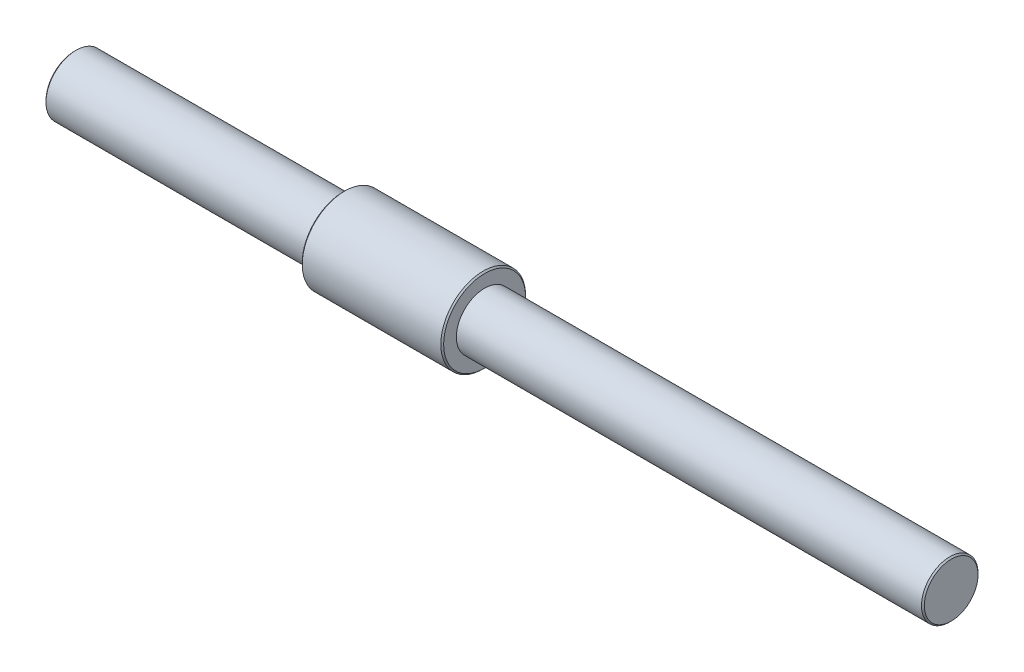
ISO-10303-21;
HEADER;
FILE_DESCRIPTION(('STEP AP214'),'2;1');
FILE_NAME('part.step','',(''),(''),'','','');
FILE_SCHEMA(('AUTOMOTIVE_DESIGN { 1 0 10303 214 1 1 1 1 }'));
ENDSEC;
DATA;
#1=APPLICATION_CONTEXT('core data for automotive mechanical design processes');
#2=APPLICATION_PROTOCOL_DEFINITION('international standard','automotive_design',2000,#1);
#3=PRODUCT_CONTEXT('',#1,'mechanical');
#4=PRODUCT('Part','Part','',(#3));
#5=PRODUCT_RELATED_PRODUCT_CATEGORY('part','',(#4));
#6=PRODUCT_DEFINITION_FORMATION('','',#4);
#7=PRODUCT_DEFINITION_CONTEXT('part definition',#1,'design');
#8=PRODUCT_DEFINITION('design','',#6,#7);
#9=PRODUCT_DEFINITION_SHAPE('','',#8);
#10=(LENGTH_UNIT() NAMED_UNIT(*) SI_UNIT(.MILLI.,.METRE.));
#11=(NAMED_UNIT(*) PLANE_ANGLE_UNIT() SI_UNIT($,.RADIAN.));
#12=(NAMED_UNIT(*) SI_UNIT($,.STERADIAN.) SOLID_ANGLE_UNIT());
#13=UNCERTAINTY_MEASURE_WITH_UNIT(LENGTH_MEASURE(1.E-05),#10,'distance_accuracy_value','');
#14=(GEOMETRIC_REPRESENTATION_CONTEXT(3) GLOBAL_UNCERTAINTY_ASSIGNED_CONTEXT((#13)) GLOBAL_UNIT_ASSIGNED_CONTEXT((#10,
#11,#12)) REPRESENTATION_CONTEXT('',''));
#15=CARTESIAN_POINT('',(0.,0.,0.));
#16=DIRECTION('',(0.,0.,1.));
#17=DIRECTION('',(1.,0.,0.));
#18=AXIS2_PLACEMENT_3D('',#15,#16,#17);
#19=CARTESIAN_POINT('',(0.,2.125,0.));
#20=DIRECTION('',(1.,0.,0.));
#21=DIRECTION('',(0.,0.,-1.));
#22=AXIS2_PLACEMENT_3D('',#19,#20,#21);
#23=PLANE('',#22);
#24=CARTESIAN_POINT('',(0.,0.,0.));
#25=DIRECTION('',(1.,0.,0.));
#26=DIRECTION('',(0.,0.,-1.));
#27=AXIS2_PLACEMENT_3D('',#24,#25,#26);
#28=CIRCLE('',#27,2.02500000000001);
#29=CARTESIAN_POINT('',(0.,0.,-2.02500000000001));
#30=VERTEX_POINT('',#29);
#31=EDGE_CURVE('E66',#30,#30,#28,.F.);
#32=ORIENTED_EDGE('',*,*,#31,.T.);
#33=EDGE_LOOP('',(#32));
#34=FACE_BOUND('',#33,.T.);
#35=ADVANCED_FACE('F36',(#34),#23,.F.);
#36=CARTESIAN_POINT('',(62.,0.,0.));
#37=DIRECTION('',(-1.,0.,0.));
#38=DIRECTION('',(0.,0.,1.));
#39=AXIS2_PLACEMENT_3D('',#36,#37,#38);
#40=PLANE('',#39);
#41=CARTESIAN_POINT('',(62.,0.,0.));
#42=DIRECTION('',(-1.,0.,0.));
#43=DIRECTION('',(0.,0.,1.));
#44=AXIS2_PLACEMENT_3D('',#41,#42,#43);
#45=CIRCLE('',#44,1.89999999999999);
#46=CARTESIAN_POINT('',(62.,0.,1.89999999999999));
#47=VERTEX_POINT('',#46);
#48=EDGE_CURVE('E48',#47,#47,#45,.F.);
#49=ORIENTED_EDGE('',*,*,#48,.T.);
#50=EDGE_LOOP('',(#49));
#51=FACE_BOUND('',#50,.T.);
#52=ADVANCED_FACE('F92',(#51),#40,.F.);
#53=CARTESIAN_POINT('',(0.,0.,0.));
#54=DIRECTION('',(-1.,0.,0.));
#55=DIRECTION('',(0.,0.,1.));
#56=AXIS2_PLACEMENT_3D('',#53,#54,#55);
#57=CYLINDRICAL_SURFACE('',#56,2.);
#58=CARTESIAN_POINT('',(61.9,0.,0.));
#59=DIRECTION('',(-1.,0.,0.));
#60=DIRECTION('',(0.,0.,1.));
#61=AXIS2_PLACEMENT_3D('',#58,#59,#60);
#62=CIRCLE('',#61,2.);
#63=CARTESIAN_POINT('',(61.9,0.,2.));
#64=VERTEX_POINT('',#63);
#65=EDGE_CURVE('E52',#64,#64,#62,.T.);
#66=ORIENTED_EDGE('',*,*,#65,.T.);
#67=EDGE_LOOP('',(#66));
#68=FACE_BOUND('',#67,.T.);
#69=CARTESIAN_POINT('',(29.,0.,0.));
#70=DIRECTION('',(-1.,0.,0.));
#71=DIRECTION('',(0.,0.,1.));
#72=AXIS2_PLACEMENT_3D('',#69,#70,#71);
#73=CIRCLE('',#72,2.);
#74=CARTESIAN_POINT('',(29.,0.,2.));
#75=VERTEX_POINT('',#74);
#76=EDGE_CURVE('E69',#75,#75,#73,.T.);
#77=ORIENTED_EDGE('',*,*,#76,.F.);
#78=EDGE_LOOP('',(#77));
#79=FACE_BOUND('',#78,.T.);
#80=ADVANCED_FACE('F98',(#68,#79),#57,.T.);
#81=CARTESIAN_POINT('',(29.,2.,0.));
#82=DIRECTION('',(-1.,0.,0.));
#83=DIRECTION('',(0.,0.,1.));
#84=AXIS2_PLACEMENT_3D('',#81,#82,#83);
#85=PLANE('',#84);
#86=CARTESIAN_POINT('',(29.,0.,0.));
#87=DIRECTION('',(-1.,0.,0.));
#88=DIRECTION('',(0.,0.,1.));
#89=AXIS2_PLACEMENT_3D('',#86,#87,#88);
#90=CIRCLE('',#89,2.90000000000001);
#91=CARTESIAN_POINT('',(29.,0.,2.9));
#92=VERTEX_POINT('',#91);
#93=EDGE_CURVE('E57',#92,#92,#90,.F.);
#94=ORIENTED_EDGE('',*,*,#93,.T.);
#95=EDGE_LOOP('',(#94));
#96=FACE_BOUND('',#95,.T.);
#97=ORIENTED_EDGE('',*,*,#76,.T.);
#98=EDGE_LOOP('',(#97));
#99=FACE_BOUND('',#98,.T.);
#100=ADVANCED_FACE('F89',(#96,#99),#85,.F.);
#101=CARTESIAN_POINT('',(0.,0.,0.));
#102=DIRECTION('',(-1.,0.,0.));
#103=DIRECTION('',(0.,0.,1.));
#104=AXIS2_PLACEMENT_3D('',#101,#102,#103);
#105=CYLINDRICAL_SURFACE('',#104,3.);
#106=CARTESIAN_POINT('',(19.1,0.,0.));
#107=DIRECTION('',(1.,0.,0.));
#108=DIRECTION('',(0.,0.,-1.));
#109=AXIS2_PLACEMENT_3D('',#106,#107,#108);
#110=CIRCLE('',#109,3.);
#111=CARTESIAN_POINT('',(19.1,0.,-3.));
#112=VERTEX_POINT('',#111);
#113=EDGE_CURVE('E10',#112,#112,#110,.T.);
#114=ORIENTED_EDGE('',*,*,#113,.T.);
#115=EDGE_LOOP('',(#114));
#116=FACE_BOUND('',#115,.T.);
#117=CARTESIAN_POINT('',(28.9,0.,0.));
#118=DIRECTION('',(-1.,0.,0.));
#119=DIRECTION('',(0.,0.,1.));
#120=AXIS2_PLACEMENT_3D('',#117,#118,#119);
#121=CIRCLE('',#120,3.);
#122=CARTESIAN_POINT('',(28.9,0.,3.));
#123=VERTEX_POINT('',#122);
#124=EDGE_CURVE('E60',#123,#123,#121,.T.);
#125=ORIENTED_EDGE('',*,*,#124,.T.);
#126=EDGE_LOOP('',(#125));
#127=FACE_BOUND('',#126,.T.);
#128=ADVANCED_FACE('F80',(#116,#127),#105,.T.);
#129=CARTESIAN_POINT('',(19.,3.,0.));
#130=DIRECTION('',(1.,0.,0.));
#131=DIRECTION('',(0.,0.,-1.));
#132=AXIS2_PLACEMENT_3D('',#129,#130,#131);
#133=PLANE('',#132);
#134=CARTESIAN_POINT('',(19.,0.,0.));
#135=DIRECTION('',(1.,0.,0.));
#136=DIRECTION('',(0.,0.,-1.));
#137=AXIS2_PLACEMENT_3D('',#134,#135,#136);
#138=CIRCLE('',#137,2.9);
#139=CARTESIAN_POINT('',(19.,0.,-2.9));
#140=VERTEX_POINT('',#139);
#141=EDGE_CURVE('E44',#140,#140,#138,.F.);
#142=ORIENTED_EDGE('',*,*,#141,.T.);
#143=EDGE_LOOP('',(#142));
#144=FACE_BOUND('',#143,.T.);
#145=CARTESIAN_POINT('',(19.,0.,0.));
#146=DIRECTION('',(-1.,0.,0.));
#147=DIRECTION('',(0.,0.,1.));
#148=AXIS2_PLACEMENT_3D('',#145,#146,#147);
#149=CIRCLE('',#148,2.125);
#150=CARTESIAN_POINT('',(19.,0.,2.125));
#151=VERTEX_POINT('',#150);
#152=EDGE_CURVE('E72',#151,#151,#149,.T.);
#153=ORIENTED_EDGE('',*,*,#152,.F.);
#154=EDGE_LOOP('',(#153));
#155=FACE_BOUND('',#154,.T.);
#156=ADVANCED_FACE('F78',(#144,#155),#133,.F.);
#157=CARTESIAN_POINT('',(0.,0.,0.));
#158=DIRECTION('',(-1.,0.,0.));
#159=DIRECTION('',(0.,0.,1.));
#160=AXIS2_PLACEMENT_3D('',#157,#158,#159);
#161=CYLINDRICAL_SURFACE('',#160,2.125);
#162=CARTESIAN_POINT('',(0.0999999999999994,0.,0.));
#163=DIRECTION('',(1.,0.,0.));
#164=DIRECTION('',(0.,0.,-1.));
#165=AXIS2_PLACEMENT_3D('',#162,#163,#164);
#166=CIRCLE('',#165,2.125);
#167=CARTESIAN_POINT('',(0.0999999999999994,0.,-2.125));
#168=VERTEX_POINT('',#167);
#169=EDGE_CURVE('E63',#168,#168,#166,.T.);
#170=ORIENTED_EDGE('',*,*,#169,.T.);
#171=EDGE_LOOP('',(#170));
#172=FACE_BOUND('',#171,.T.);
#173=ORIENTED_EDGE('',*,*,#152,.T.);
#174=EDGE_LOOP('',(#173));
#175=FACE_BOUND('',#174,.T.);
#176=ADVANCED_FACE('F76',(#172,#175),#161,.T.);
#177=CARTESIAN_POINT('',(0.,0.,0.));
#178=DIRECTION('',(1.,0.,0.));
#179=DIRECTION('',(0.,0.,-1.));
#180=AXIS2_PLACEMENT_3D('',#177,#178,#179);
#181=CONICAL_SURFACE('',#180,2.02500000000001,0.785398163397427);
#182=ORIENTED_EDGE('',*,*,#169,.F.);
#183=EDGE_LOOP('',(#182));
#184=FACE_BOUND('',#183,.T.);
#185=ORIENTED_EDGE('',*,*,#31,.F.);
#186=EDGE_LOOP('',(#185));
#187=FACE_BOUND('',#186,.T.);
#188=ADVANCED_FACE('F86',(#184,#187),#181,.T.);
#189=CARTESIAN_POINT('',(28.9,0.,0.));
#190=DIRECTION('',(-1.,0.,0.));
#191=DIRECTION('',(0.,0.,1.));
#192=AXIS2_PLACEMENT_3D('',#189,#190,#191);
#193=CONICAL_SURFACE('',#192,3.,0.785398163397466);
#194=CARTESIAN_POINT('',(29.,0.,2.9));
#195=CARTESIAN_POINT('',(28.9989583333333,0.,2.90104166666667));
#196=CARTESIAN_POINT('',(28.9979166666667,0.,2.90208333333334));
#197=CARTESIAN_POINT('',(28.9958333333333,0.,2.90416666666667));
#198=CARTESIAN_POINT('',(28.9947916666667,0.,2.90520833333334));
#199=CARTESIAN_POINT('',(28.9927083333333,0.,2.90729166666667));
#200=CARTESIAN_POINT('',(28.9916666666667,0.,2.90833333333334));
#201=CARTESIAN_POINT('',(28.9895833333333,0.,2.91041666666667));
#202=CARTESIAN_POINT('',(28.9885416666667,0.,2.91145833333334));
#203=CARTESIAN_POINT('',(28.9864583333333,0.,2.91354166666667));
#204=CARTESIAN_POINT('',(28.9854166666667,0.,2.91458333333334));
#205=CARTESIAN_POINT('',(28.9833333333333,0.,2.91666666666667));
#206=CARTESIAN_POINT('',(28.9822916666667,0.,2.91770833333334));
#207=CARTESIAN_POINT('',(28.9802083333333,0.,2.91979166666667));
#208=CARTESIAN_POINT('',(28.9791666666667,0.,2.92083333333334));
#209=CARTESIAN_POINT('',(28.9770833333333,0.,2.92291666666667));
#210=CARTESIAN_POINT('',(28.9760416666667,0.,2.92395833333334));
#211=CARTESIAN_POINT('',(28.9739583333333,0.,2.92604166666667));
#212=CARTESIAN_POINT('',(28.9729166666667,0.,2.92708333333334));
#213=CARTESIAN_POINT('',(28.9708333333333,0.,2.92916666666667));
#214=CARTESIAN_POINT('',(28.9697916666667,0.,2.93020833333334));
#215=CARTESIAN_POINT('',(28.9677083333333,0.,2.93229166666667));
#216=CARTESIAN_POINT('',(28.9666666666667,0.,2.93333333333334));
#217=CARTESIAN_POINT('',(28.9645833333333,0.,2.93541666666667));
#218=CARTESIAN_POINT('',(28.9635416666667,0.,2.93645833333334));
#219=CARTESIAN_POINT('',(28.9614583333333,0.,2.93854166666667));
#220=CARTESIAN_POINT('',(28.9604166666667,0.,2.93958333333334));
#221=CARTESIAN_POINT('',(28.9583333333333,0.,2.94166666666667));
#222=CARTESIAN_POINT('',(28.9572916666667,0.,2.94270833333334));
#223=CARTESIAN_POINT('',(28.9552083333333,0.,2.94479166666667));
#224=CARTESIAN_POINT('',(28.9541666666667,0.,2.94583333333334));
#225=CARTESIAN_POINT('',(28.9520833333333,0.,2.94791666666667));
#226=CARTESIAN_POINT('',(28.9510416666667,0.,2.94895833333333));
#227=CARTESIAN_POINT('',(28.9489583333333,0.,2.95104166666667));
#228=CARTESIAN_POINT('',(28.9479166666667,0.,2.95208333333333));
#229=CARTESIAN_POINT('',(28.9458333333333,0.,2.95416666666667));
#230=CARTESIAN_POINT('',(28.9447916666667,0.,2.95520833333333));
#231=CARTESIAN_POINT('',(28.9427083333333,0.,2.95729166666667));
#232=CARTESIAN_POINT('',(28.9416666666667,0.,2.95833333333333));
#233=CARTESIAN_POINT('',(28.9395833333333,0.,2.96041666666667));
#234=CARTESIAN_POINT('',(28.9385416666667,0.,2.96145833333333));
#235=CARTESIAN_POINT('',(28.9364583333333,0.,2.96354166666667));
#236=CARTESIAN_POINT('',(28.9354166666667,0.,2.96458333333333));
#237=CARTESIAN_POINT('',(28.9333333333333,0.,2.96666666666667));
#238=CARTESIAN_POINT('',(28.9322916666667,0.,2.96770833333333));
#239=CARTESIAN_POINT('',(28.9302083333333,0.,2.96979166666667));
#240=CARTESIAN_POINT('',(28.9291666666667,0.,2.97083333333333));
#241=CARTESIAN_POINT('',(28.9270833333333,0.,2.97291666666667));
#242=CARTESIAN_POINT('',(28.9260416666667,0.,2.97395833333333));
#243=CARTESIAN_POINT('',(28.9239583333333,0.,2.97604166666667));
#244=CARTESIAN_POINT('',(28.9229166666667,0.,2.97708333333333));
#245=CARTESIAN_POINT('',(28.9208333333333,0.,2.97916666666667));
#246=CARTESIAN_POINT('',(28.9197916666667,0.,2.98020833333333));
#247=CARTESIAN_POINT('',(28.9177083333333,0.,2.98229166666667));
#248=CARTESIAN_POINT('',(28.9166666666667,0.,2.98333333333333));
#249=CARTESIAN_POINT('',(28.9145833333333,0.,2.98541666666667));
#250=CARTESIAN_POINT('',(28.9135416666667,0.,2.98645833333333));
#251=CARTESIAN_POINT('',(28.9114583333333,0.,2.98854166666667));
#252=CARTESIAN_POINT('',(28.9104166666667,0.,2.98958333333333));
#253=CARTESIAN_POINT('',(28.9083333333333,0.,2.99166666666666));
#254=CARTESIAN_POINT('',(28.9072916666667,0.,2.99270833333333));
#255=CARTESIAN_POINT('',(28.9052083333333,0.,2.99479166666666));
#256=CARTESIAN_POINT('',(28.9041666666667,0.,2.99583333333333));
#257=CARTESIAN_POINT('',(28.9020833333333,0.,2.99791666666666));
#258=CARTESIAN_POINT('',(28.9010416666667,0.,2.99895833333333));
#259=CARTESIAN_POINT('',(28.9,0.,3.));
#260=B_SPLINE_CURVE_WITH_KNOTS('',3,(#194,#195,#196,#197,#198,#199,#200,#201,#202,#203,#204,
#205,#206,#207,#208,#209,#210,#211,#212,#213,#214,#215,#216,#217,#218,#219,#220,#221,#222,#223,
#224,#225,#226,#227,#228,#229,#230,#231,#232,#233,#234,#235,#236,#237,#238,#239,#240,#241,#242,
#243,#244,#245,#246,#247,#248,#249,#250,#251,#252,#253,#254,#255,#256,#257,#258,#259),
.UNSPECIFIED.,.F.,.F.,(4,2,2,2,2,2,2,2,2,2,2,2,2,2,2,2,2,2,2,2,2,2,2,2,2,2,2,2,2,2,2,2,4),(0.,
0.00441941738241544,0.00883883476483087,0.0132582521472466,0.017677669529662,0.0220970869120775,
0.0265165042944932,0.0309359216769087,0.0353553390593241,0.0397747564417395,0.044194173824155,
0.0486135912065707,0.0530330085889861,0.0574524259714016,0.0618718433538173,0.0662912607362327,
0.0707106781186482,0.0751300955010636,0.0795495128834791,0.0839689302658948,0.0883883476483102,
0.0928077650307257,0.0972271824131414,0.101646599795557,0.106066017177972,0.110485434560388,
0.114904851942803,0.119324269325219,0.123743686707634,0.12816310409005,0.132582521472466,
0.137001938854881,0.141421356237296),.UNSPECIFIED.);
#261=EDGE_CURVE('BSEAM109',#92,#123,#260,.T.);
#262=ORIENTED_EDGE('',*,*,#93,.F.);
#263=ORIENTED_EDGE('',*,*,#124,.F.);
#264=ORIENTED_EDGE('',*,*,#261,.T.);
#265=ORIENTED_EDGE('',*,*,#261,.F.);
#266=EDGE_LOOP('',(#262,#264,#263,#265));
#267=FACE_BOUND('',#266,.T.);
#268=ADVANCED_FACE('F109',(#267),#193,.T.);
#269=CARTESIAN_POINT('',(61.9,0.,0.));
#270=DIRECTION('',(-1.,0.,0.));
#271=DIRECTION('',(0.,0.,1.));
#272=AXIS2_PLACEMENT_3D('',#269,#270,#271);
#273=CONICAL_SURFACE('',#272,2.,0.78539816339737);
#274=ORIENTED_EDGE('',*,*,#48,.F.);
#275=EDGE_LOOP('',(#274));
#276=FACE_BOUND('',#275,.T.);
#277=ORIENTED_EDGE('',*,*,#65,.F.);
#278=EDGE_LOOP('',(#277));
#279=FACE_BOUND('',#278,.T.);
#280=ADVANCED_FACE('F115',(#276,#279),#273,.T.);
#281=CARTESIAN_POINT('',(19.,0.,0.));
#282=DIRECTION('',(1.,0.,0.));
#283=DIRECTION('',(0.,0.,-1.));
#284=AXIS2_PLACEMENT_3D('',#281,#282,#283);
#285=CONICAL_SURFACE('',#284,2.9,0.785398163397396);
#286=ORIENTED_EDGE('',*,*,#113,.F.);
#287=EDGE_LOOP('',(#286));
#288=FACE_BOUND('',#287,.T.);
#289=ORIENTED_EDGE('',*,*,#141,.F.);
#290=EDGE_LOOP('',(#289));
#291=FACE_BOUND('',#290,.T.);
#292=ADVANCED_FACE('F39',(#288,#291),#285,.T.);
#293=CLOSED_SHELL('',(#35,#52,#80,#100,#128,#156,#176,#188,#268,#280,#292));
#294=MANIFOLD_SOLID_BREP('B2',#293);
#295=ADVANCED_BREP_SHAPE_REPRESENTATION('',(#18,#294),#14);
#296=SHAPE_DEFINITION_REPRESENTATION(#9,#295);
ENDSEC;
END-ISO-10303-21;
